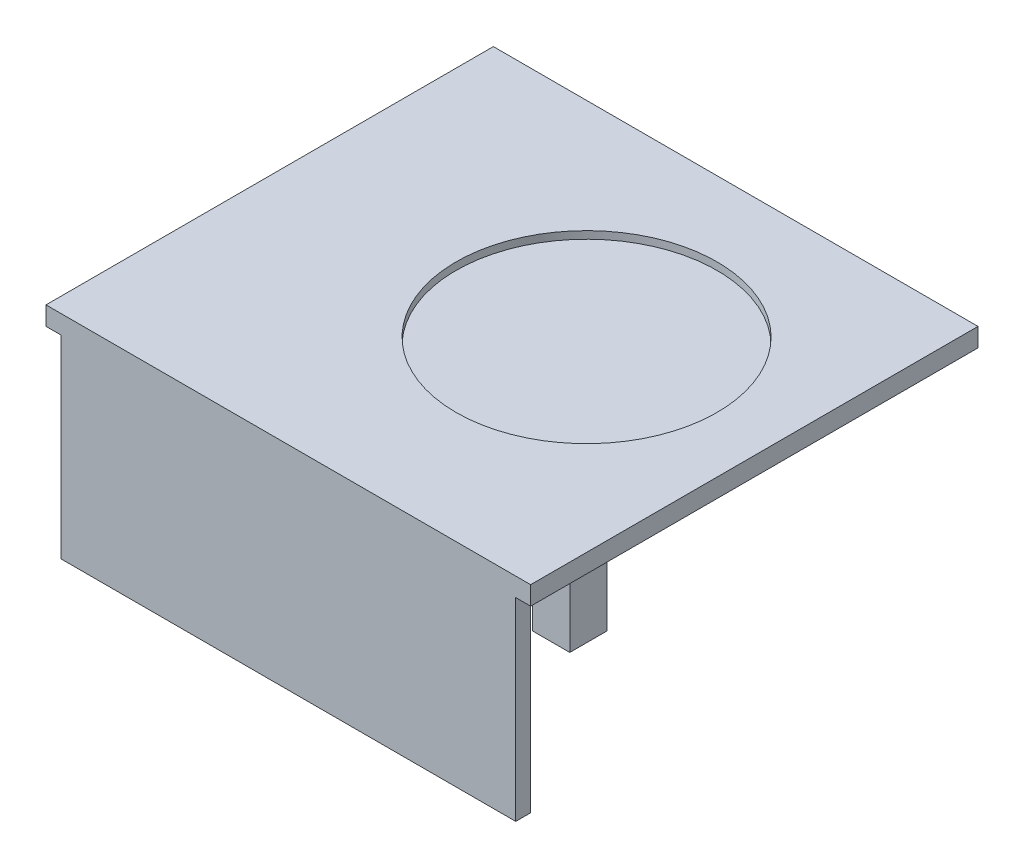
ISO-10303-21;
HEADER;
FILE_DESCRIPTION(('STEP AP214'),'2;1');
FILE_NAME('part.step','',(''),(''),'','','');
FILE_SCHEMA(('AUTOMOTIVE_DESIGN { 1 0 10303 214 1 1 1 1 }'));
ENDSEC;
DATA;
#1=APPLICATION_CONTEXT('core data for automotive mechanical design processes');
#2=APPLICATION_PROTOCOL_DEFINITION('international standard','automotive_design',2000,#1);
#3=PRODUCT_CONTEXT('',#1,'mechanical');
#4=PRODUCT('Part','Part','',(#3));
#5=PRODUCT_RELATED_PRODUCT_CATEGORY('part','',(#4));
#6=PRODUCT_DEFINITION_FORMATION('','',#4);
#7=PRODUCT_DEFINITION_CONTEXT('part definition',#1,'design');
#8=PRODUCT_DEFINITION('design','',#6,#7);
#9=PRODUCT_DEFINITION_SHAPE('','',#8);
#10=(LENGTH_UNIT() NAMED_UNIT(*) SI_UNIT(.MILLI.,.METRE.));
#11=(NAMED_UNIT(*) PLANE_ANGLE_UNIT() SI_UNIT($,.RADIAN.));
#12=(NAMED_UNIT(*) SI_UNIT($,.STERADIAN.) SOLID_ANGLE_UNIT());
#13=UNCERTAINTY_MEASURE_WITH_UNIT(LENGTH_MEASURE(1.E-05),#10,'distance_accuracy_value','');
#14=(GEOMETRIC_REPRESENTATION_CONTEXT(3) GLOBAL_UNCERTAINTY_ASSIGNED_CONTEXT((#13)) GLOBAL_UNIT_ASSIGNED_CONTEXT((#10,
#11,#12)) REPRESENTATION_CONTEXT('',''));
#15=CARTESIAN_POINT('',(0.,0.,0.));
#16=DIRECTION('',(0.,0.,1.));
#17=DIRECTION('',(1.,0.,0.));
#18=AXIS2_PLACEMENT_3D('',#15,#16,#17);
#19=CARTESIAN_POINT('',(0.,0.,0.));
#20=DIRECTION('',(0.,-1.,0.));
#21=DIRECTION('',(0.,0.,-1.));
#22=AXIS2_PLACEMENT_3D('',#19,#20,#21);
#23=PLANE('',#22);
#24=DIRECTION('',(0.,0.,1.));
#25=VECTOR('',#24,1.);
#26=CARTESIAN_POINT('',(61.,0.,56.));
#27=LINE('',#26,#25);
#28=CARTESIAN_POINT('',(61.,0.,56.));
#29=VERTEX_POINT('',#28);
#30=CARTESIAN_POINT('',(61.,0.,60.));
#31=VERTEX_POINT('',#30);
#32=EDGE_CURVE('E178',#29,#31,#27,.T.);
#33=ORIENTED_EDGE('',*,*,#32,.F.);
#34=DIRECTION('',(1.,0.,0.));
#35=VECTOR('',#34,1.);
#36=CARTESIAN_POINT('',(-65.,0.,56.));
#37=LINE('',#36,#35);
#38=CARTESIAN_POINT('',(-61.,0.,56.));
#39=VERTEX_POINT('',#38);
#40=EDGE_CURVE('E171',#39,#29,#37,.T.);
#41=ORIENTED_EDGE('',*,*,#40,.F.);
#42=DIRECTION('',(0.,0.,-1.));
#43=VECTOR('',#42,1.);
#44=CARTESIAN_POINT('',(-61.,0.,61.));
#45=LINE('',#44,#43);
#46=CARTESIAN_POINT('',(-61.,0.,60.));
#47=VERTEX_POINT('',#46);
#48=EDGE_CURVE('E157',#47,#39,#45,.T.);
#49=ORIENTED_EDGE('',*,*,#48,.F.);
#50=DIRECTION('',(1.,0.,0.));
#51=VECTOR('',#50,1.);
#52=CARTESIAN_POINT('',(65.,0.,60.));
#53=LINE('',#52,#51);
#54=CARTESIAN_POINT('',(-65.,0.,60.));
#55=VERTEX_POINT('',#54);
#56=EDGE_CURVE('E242',#55,#47,#53,.T.);
#57=ORIENTED_EDGE('',*,*,#56,.F.);
#58=DIRECTION('',(0.,0.,1.));
#59=VECTOR('',#58,1.);
#60=CARTESIAN_POINT('',(-65.,0.,60.));
#61=LINE('',#60,#59);
#62=CARTESIAN_POINT('',(-65.,0.,-60.));
#63=VERTEX_POINT('',#62);
#64=EDGE_CURVE('E201',#63,#55,#61,.T.);
#65=ORIENTED_EDGE('',*,*,#64,.F.);
#66=DIRECTION('',(-1.,0.,0.));
#67=VECTOR('',#66,1.);
#68=CARTESIAN_POINT('',(-65.,0.,-60.));
#69=LINE('',#68,#67);
#70=CARTESIAN_POINT('',(65.,0.,-60.));
#71=VERTEX_POINT('',#70);
#72=EDGE_CURVE('E207',#71,#63,#69,.T.);
#73=ORIENTED_EDGE('',*,*,#72,.F.);
#74=DIRECTION('',(0.,0.,-1.));
#75=VECTOR('',#74,1.);
#76=CARTESIAN_POINT('',(65.,0.,-60.));
#77=LINE('',#76,#75);
#78=CARTESIAN_POINT('',(65.,0.,60.));
#79=VERTEX_POINT('',#78);
#80=EDGE_CURVE('E222',#79,#71,#77,.T.);
#81=ORIENTED_EDGE('',*,*,#80,.F.);
#82=DIRECTION('',(1.,0.,0.));
#83=VECTOR('',#82,1.);
#84=CARTESIAN_POINT('',(65.,0.,60.));
#85=LINE('',#84,#83);
#86=EDGE_CURVE('E219',#31,#79,#85,.T.);
#87=ORIENTED_EDGE('',*,*,#86,.F.);
#88=EDGE_LOOP('',(#33,#41,#49,#57,#65,#73,#81,#87));
#89=FACE_BOUND('',#88,.T.);
#90=DIRECTION('',(-1.,0.,0.));
#91=VECTOR('',#90,1.);
#92=CARTESIAN_POINT('',(61.,0.,45.5));
#93=LINE('',#92,#91);
#94=CARTESIAN_POINT('',(61.,0.,45.5));
#95=VERTEX_POINT('',#94);
#96=CARTESIAN_POINT('',(51.,0.,45.5));
#97=VERTEX_POINT('',#96);
#98=EDGE_CURVE('E317',#95,#97,#93,.T.);
#99=ORIENTED_EDGE('',*,*,#98,.F.);
#100=DIRECTION('',(0.,0.,1.));
#101=VECTOR('',#100,1.);
#102=CARTESIAN_POINT('',(61.,0.,35.5));
#103=LINE('',#102,#101);
#104=CARTESIAN_POINT('',(61.,0.,35.5));
#105=VERTEX_POINT('',#104);
#106=EDGE_CURVE('E278',#105,#95,#103,.T.);
#107=ORIENTED_EDGE('',*,*,#106,.F.);
#108=DIRECTION('',(1.,0.,0.));
#109=VECTOR('',#108,1.);
#110=CARTESIAN_POINT('',(51.,0.,35.5));
#111=LINE('',#110,#109);
#112=CARTESIAN_POINT('',(51.,0.,35.5));
#113=VERTEX_POINT('',#112);
#114=EDGE_CURVE('E309',#113,#105,#111,.T.);
#115=ORIENTED_EDGE('',*,*,#114,.F.);
#116=DIRECTION('',(0.,0.,-1.));
#117=VECTOR('',#116,1.);
#118=CARTESIAN_POINT('',(51.,0.,45.5));
#119=LINE('',#118,#117);
#120=EDGE_CURVE('E312',#97,#113,#119,.T.);
#121=ORIENTED_EDGE('',*,*,#120,.F.);
#122=EDGE_LOOP('',(#99,#107,#115,#121));
#123=FACE_BOUND('',#122,.T.);
#124=DIRECTION('',(1.,0.,0.));
#125=VECTOR('',#124,1.);
#126=CARTESIAN_POINT('',(-51.,0.,35.5));
#127=LINE('',#126,#125);
#128=CARTESIAN_POINT('',(-61.,0.,35.5));
#129=VERTEX_POINT('',#128);
#130=CARTESIAN_POINT('',(-51.,0.,35.5));
#131=VERTEX_POINT('',#130);
#132=EDGE_CURVE('E277',#129,#131,#127,.T.);
#133=ORIENTED_EDGE('',*,*,#132,.F.);
#134=DIRECTION('',(0.,0.,-1.));
#135=VECTOR('',#134,1.);
#136=CARTESIAN_POINT('',(-61.,0.,35.5));
#137=LINE('',#136,#135);
#138=CARTESIAN_POINT('',(-61.,0.,45.5));
#139=VERTEX_POINT('',#138);
#140=EDGE_CURVE('E273',#139,#129,#137,.T.);
#141=ORIENTED_EDGE('',*,*,#140,.F.);
#142=DIRECTION('',(-1.,0.,0.));
#143=VECTOR('',#142,1.);
#144=CARTESIAN_POINT('',(-61.,0.,45.5));
#145=LINE('',#144,#143);
#146=CARTESIAN_POINT('',(-51.,0.,45.5));
#147=VERTEX_POINT('',#146);
#148=EDGE_CURVE('E263',#147,#139,#145,.T.);
#149=ORIENTED_EDGE('',*,*,#148,.F.);
#150=DIRECTION('',(0.,0.,1.));
#151=VECTOR('',#150,1.);
#152=CARTESIAN_POINT('',(-51.,0.,45.5));
#153=LINE('',#152,#151);
#154=EDGE_CURVE('E281',#131,#147,#153,.T.);
#155=ORIENTED_EDGE('',*,*,#154,.F.);
#156=EDGE_LOOP('',(#133,#141,#149,#155));
#157=FACE_BOUND('',#156,.T.);
#158=ADVANCED_FACE('F45',(#89,#123,#157),#23,.T.);
#159=CARTESIAN_POINT('',(-65.,5.,60.));
#160=DIRECTION('',(1.,0.,0.));
#161=DIRECTION('',(0.,0.,-1.));
#162=AXIS2_PLACEMENT_3D('',#159,#160,#161);
#163=PLANE('',#162);
#164=ORIENTED_EDGE('',*,*,#64,.T.);
#165=DIRECTION('',(0.,-1.,0.));
#166=VECTOR('',#165,1.);
#167=CARTESIAN_POINT('',(-65.,5.,60.));
#168=LINE('',#167,#166);
#169=CARTESIAN_POINT('',(-65.,5.,60.));
#170=VERTEX_POINT('',#169);
#171=EDGE_CURVE('E54',#170,#55,#168,.T.);
#172=ORIENTED_EDGE('',*,*,#171,.F.);
#173=DIRECTION('',(0.,0.,1.));
#174=VECTOR('',#173,1.);
#175=CARTESIAN_POINT('',(-65.,5.,60.));
#176=LINE('',#175,#174);
#177=CARTESIAN_POINT('',(-65.,5.,-60.));
#178=VERTEX_POINT('',#177);
#179=EDGE_CURVE('E202',#178,#170,#176,.T.);
#180=ORIENTED_EDGE('',*,*,#179,.F.);
#181=DIRECTION('',(0.,-1.,0.));
#182=VECTOR('',#181,1.);
#183=CARTESIAN_POINT('',(-65.,5.,-60.));
#184=LINE('',#183,#182);
#185=EDGE_CURVE('E216',#178,#63,#184,.T.);
#186=ORIENTED_EDGE('',*,*,#185,.T.);
#187=EDGE_LOOP('',(#164,#172,#180,#186));
#188=FACE_BOUND('',#187,.T.);
#189=ADVANCED_FACE('F47',(#188),#163,.F.);
#190=CARTESIAN_POINT('',(65.,5.,60.));
#191=DIRECTION('',(0.,0.,-1.));
#192=DIRECTION('',(-1.,0.,0.));
#193=AXIS2_PLACEMENT_3D('',#190,#191,#192);
#194=PLANE('',#193);
#195=ORIENTED_EDGE('',*,*,#56,.T.);
#196=DIRECTION('',(0.,-1.,0.));
#197=VECTOR('',#196,1.);
#198=CARTESIAN_POINT('',(-61.,5.00000000000002,60.));
#199=LINE('',#198,#197);
#200=CARTESIAN_POINT('',(-61.,-52.,60.));
#201=VERTEX_POINT('',#200);
#202=EDGE_CURVE('E160',#47,#201,#199,.T.);
#203=ORIENTED_EDGE('',*,*,#202,.T.);
#204=DIRECTION('',(-1.,0.,0.));
#205=VECTOR('',#204,1.);
#206=CARTESIAN_POINT('',(61.,-52.,60.));
#207=LINE('',#206,#205);
#208=CARTESIAN_POINT('',(61.,-52.,60.));
#209=VERTEX_POINT('',#208);
#210=EDGE_CURVE('E185',#209,#201,#207,.T.);
#211=ORIENTED_EDGE('',*,*,#210,.F.);
#212=DIRECTION('',(0.,1.,0.));
#213=VECTOR('',#212,1.);
#214=CARTESIAN_POINT('',(61.,-52.,60.));
#215=LINE('',#214,#213);
#216=EDGE_CURVE('E194',#209,#31,#215,.T.);
#217=ORIENTED_EDGE('',*,*,#216,.T.);
#218=ORIENTED_EDGE('',*,*,#86,.T.);
#219=DIRECTION('',(0.,-1.,0.));
#220=VECTOR('',#219,1.);
#221=CARTESIAN_POINT('',(65.,5.,60.));
#222=LINE('',#221,#220);
#223=CARTESIAN_POINT('',(65.,5.,60.));
#224=VERTEX_POINT('',#223);
#225=EDGE_CURVE('E234',#224,#79,#222,.T.);
#226=ORIENTED_EDGE('',*,*,#225,.F.);
#227=DIRECTION('',(1.,0.,0.));
#228=VECTOR('',#227,1.);
#229=CARTESIAN_POINT('',(65.,5.,60.));
#230=LINE('',#229,#228);
#231=EDGE_CURVE('E206',#170,#224,#230,.T.);
#232=ORIENTED_EDGE('',*,*,#231,.F.);
#233=ORIENTED_EDGE('',*,*,#171,.T.);
#234=EDGE_LOOP('',(#195,#203,#211,#217,#218,#226,#232,#233));
#235=FACE_BOUND('',#234,.T.);
#236=ADVANCED_FACE('F241',(#235),#194,.F.);
#237=CARTESIAN_POINT('',(65.,5.,-60.));
#238=DIRECTION('',(-1.,0.,0.));
#239=DIRECTION('',(0.,0.,1.));
#240=AXIS2_PLACEMENT_3D('',#237,#238,#239);
#241=PLANE('',#240);
#242=ORIENTED_EDGE('',*,*,#80,.T.);
#243=DIRECTION('',(0.,-1.,0.));
#244=VECTOR('',#243,1.);
#245=CARTESIAN_POINT('',(65.,5.,-60.));
#246=LINE('',#245,#244);
#247=CARTESIAN_POINT('',(65.,5.,-60.));
#248=VERTEX_POINT('',#247);
#249=EDGE_CURVE('E230',#248,#71,#246,.T.);
#250=ORIENTED_EDGE('',*,*,#249,.F.);
#251=DIRECTION('',(0.,0.,-1.));
#252=VECTOR('',#251,1.);
#253=CARTESIAN_POINT('',(65.,5.,-60.));
#254=LINE('',#253,#252);
#255=EDGE_CURVE('E210',#224,#248,#254,.T.);
#256=ORIENTED_EDGE('',*,*,#255,.F.);
#257=ORIENTED_EDGE('',*,*,#225,.T.);
#258=EDGE_LOOP('',(#242,#250,#256,#257));
#259=FACE_BOUND('',#258,.T.);
#260=ADVANCED_FACE('F351',(#259),#241,.F.);
#261=CARTESIAN_POINT('',(-65.,5.,-60.));
#262=DIRECTION('',(0.,0.,1.));
#263=DIRECTION('',(1.,0.,0.));
#264=AXIS2_PLACEMENT_3D('',#261,#262,#263);
#265=PLANE('',#264);
#266=ORIENTED_EDGE('',*,*,#72,.T.);
#267=ORIENTED_EDGE('',*,*,#185,.F.);
#268=DIRECTION('',(-1.,0.,0.));
#269=VECTOR('',#268,1.);
#270=CARTESIAN_POINT('',(-65.,5.,-60.));
#271=LINE('',#270,#269);
#272=EDGE_CURVE('E213',#248,#178,#271,.T.);
#273=ORIENTED_EDGE('',*,*,#272,.F.);
#274=ORIENTED_EDGE('',*,*,#249,.T.);
#275=EDGE_LOOP('',(#266,#267,#273,#274));
#276=FACE_BOUND('',#275,.T.);
#277=ADVANCED_FACE('F354',(#276),#265,.F.);
#278=CARTESIAN_POINT('',(0.,5.,0.));
#279=DIRECTION('',(0.,-1.,0.));
#280=DIRECTION('',(0.,0.,-1.));
#281=AXIS2_PLACEMENT_3D('',#278,#279,#280);
#282=PLANE('',#281);
#283=CARTESIAN_POINT('',(15.,5.,-5.));
#284=DIRECTION('',(0.,1.,0.));
#285=DIRECTION('',(0.,0.,1.));
#286=AXIS2_PLACEMENT_3D('',#283,#284,#285);
#287=CIRCLE('',#286,35.);
#288=CARTESIAN_POINT('',(15.,5.,30.));
#289=VERTEX_POINT('',#288);
#290=EDGE_CURVE('E188',#289,#289,#287,.T.);
#291=ORIENTED_EDGE('',*,*,#290,.F.);
#292=EDGE_LOOP('',(#291));
#293=FACE_BOUND('',#292,.T.);
#294=ORIENTED_EDGE('',*,*,#179,.T.);
#295=ORIENTED_EDGE('',*,*,#231,.T.);
#296=ORIENTED_EDGE('',*,*,#255,.T.);
#297=ORIENTED_EDGE('',*,*,#272,.T.);
#298=EDGE_LOOP('',(#294,#295,#296,#297));
#299=FACE_BOUND('',#298,.T.);
#300=ADVANCED_FACE('F357',(#293,#299),#282,.F.);
#301=CARTESIAN_POINT('',(-65.,-52.,56.));
#302=DIRECTION('',(0.,0.,1.));
#303=DIRECTION('',(1.,0.,0.));
#304=AXIS2_PLACEMENT_3D('',#301,#302,#303);
#305=PLANE('',#304);
#306=DIRECTION('',(1.,0.,0.));
#307=VECTOR('',#306,1.);
#308=CARTESIAN_POINT('',(-65.,-52.,56.));
#309=LINE('',#308,#307);
#310=CARTESIAN_POINT('',(-61.,-52.,56.));
#311=VERTEX_POINT('',#310);
#312=CARTESIAN_POINT('',(61.,-52.,56.));
#313=VERTEX_POINT('',#312);
#314=EDGE_CURVE('E173',#311,#313,#309,.T.);
#315=ORIENTED_EDGE('',*,*,#314,.F.);
#316=DIRECTION('',(0.,-1.,0.));
#317=VECTOR('',#316,1.);
#318=CARTESIAN_POINT('',(-61.,0.,56.));
#319=LINE('',#318,#317);
#320=EDGE_CURVE('E60',#39,#311,#319,.T.);
#321=ORIENTED_EDGE('',*,*,#320,.F.);
#322=ORIENTED_EDGE('',*,*,#40,.T.);
#323=DIRECTION('',(0.,1.,0.));
#324=VECTOR('',#323,1.);
#325=CARTESIAN_POINT('',(61.,-52.,56.));
#326=LINE('',#325,#324);
#327=EDGE_CURVE('E198',#313,#29,#326,.T.);
#328=ORIENTED_EDGE('',*,*,#327,.F.);
#329=EDGE_LOOP('',(#315,#321,#322,#328));
#330=FACE_BOUND('',#329,.T.);
#331=ADVANCED_FACE('F169',(#330),#305,.F.);
#332=CARTESIAN_POINT('',(61.,-52.,56.));
#333=DIRECTION('',(-1.,0.,0.));
#334=DIRECTION('',(0.,0.,1.));
#335=AXIS2_PLACEMENT_3D('',#332,#333,#334);
#336=PLANE('',#335);
#337=ORIENTED_EDGE('',*,*,#32,.T.);
#338=ORIENTED_EDGE('',*,*,#216,.F.);
#339=DIRECTION('',(0.,0.,1.));
#340=VECTOR('',#339,1.);
#341=CARTESIAN_POINT('',(61.,-52.,56.));
#342=LINE('',#341,#340);
#343=EDGE_CURVE('E191',#313,#209,#342,.T.);
#344=ORIENTED_EDGE('',*,*,#343,.F.);
#345=ORIENTED_EDGE('',*,*,#327,.T.);
#346=EDGE_LOOP('',(#337,#338,#344,#345));
#347=FACE_BOUND('',#346,.T.);
#348=ADVANCED_FACE('F347',(#347),#336,.F.);
#349=CARTESIAN_POINT('',(0.,-52.,0.));
#350=DIRECTION('',(0.,-1.,0.));
#351=DIRECTION('',(0.,0.,-1.));
#352=AXIS2_PLACEMENT_3D('',#349,#350,#351);
#353=PLANE('',#352);
#354=DIRECTION('',(0.,0.,1.));
#355=VECTOR('',#354,1.);
#356=CARTESIAN_POINT('',(-61.,-52.,0.));
#357=LINE('',#356,#355);
#358=EDGE_CURVE('E11',#311,#201,#357,.T.);
#359=ORIENTED_EDGE('',*,*,#358,.F.);
#360=ORIENTED_EDGE('',*,*,#314,.T.);
#361=ORIENTED_EDGE('',*,*,#343,.T.);
#362=ORIENTED_EDGE('',*,*,#210,.T.);
#363=EDGE_LOOP('',(#359,#360,#361,#362));
#364=FACE_BOUND('',#363,.T.);
#365=ADVANCED_FACE('F344',(#364),#353,.T.);
#366=CARTESIAN_POINT('',(15.,3.,-5.));
#367=DIRECTION('',(0.,1.,0.));
#368=DIRECTION('',(0.,0.,1.));
#369=AXIS2_PLACEMENT_3D('',#366,#367,#368);
#370=CYLINDRICAL_SURFACE('',#369,35.);
#371=CARTESIAN_POINT('',(15.,3.,-5.));
#372=DIRECTION('',(0.,1.,0.));
#373=DIRECTION('',(0.,0.,1.));
#374=AXIS2_PLACEMENT_3D('',#371,#372,#373);
#375=CIRCLE('',#374,35.);
#376=CARTESIAN_POINT('',(15.,3.,30.));
#377=VERTEX_POINT('',#376);
#378=EDGE_CURVE('E181',#377,#377,#375,.T.);
#379=ORIENTED_EDGE('',*,*,#378,.F.);
#380=EDGE_LOOP('',(#379));
#381=FACE_BOUND('',#380,.T.);
#382=ORIENTED_EDGE('',*,*,#290,.T.);
#383=EDGE_LOOP('',(#382));
#384=FACE_BOUND('',#383,.T.);
#385=ADVANCED_FACE('F396',(#381,#384),#370,.F.);
#386=CARTESIAN_POINT('',(15.,3.,-5.));
#387=DIRECTION('',(0.,1.,0.));
#388=DIRECTION('',(0.,0.,1.));
#389=AXIS2_PLACEMENT_3D('',#386,#387,#388);
#390=PLANE('',#389);
#391=ORIENTED_EDGE('',*,*,#378,.T.);
#392=EDGE_LOOP('',(#391));
#393=FACE_BOUND('',#392,.T.);
#394=ADVANCED_FACE('F510',(#393),#390,.T.);
#395=CARTESIAN_POINT('',(61.,-20.,35.5));
#396=DIRECTION('',(-1.,0.,0.));
#397=DIRECTION('',(0.,0.,1.));
#398=AXIS2_PLACEMENT_3D('',#395,#396,#397);
#399=PLANE('',#398);
#400=ORIENTED_EDGE('',*,*,#106,.T.);
#401=DIRECTION('',(0.,1.,0.));
#402=VECTOR('',#401,1.);
#403=CARTESIAN_POINT('',(61.,-20.,45.5));
#404=LINE('',#403,#402);
#405=CARTESIAN_POINT('',(61.,-20.,45.5));
#406=VERTEX_POINT('',#405);
#407=EDGE_CURVE('E250',#406,#95,#404,.T.);
#408=ORIENTED_EDGE('',*,*,#407,.F.);
#409=DIRECTION('',(0.,0.,1.));
#410=VECTOR('',#409,1.);
#411=CARTESIAN_POINT('',(61.,-20.,35.5));
#412=LINE('',#411,#410);
#413=CARTESIAN_POINT('',(61.,-20.,35.5));
#414=VERTEX_POINT('',#413);
#415=EDGE_CURVE('E313',#414,#406,#412,.T.);
#416=ORIENTED_EDGE('',*,*,#415,.F.);
#417=DIRECTION('',(0.,1.,0.));
#418=VECTOR('',#417,1.);
#419=CARTESIAN_POINT('',(61.,-20.,35.5));
#420=LINE('',#419,#418);
#421=EDGE_CURVE('E304',#414,#105,#420,.T.);
#422=ORIENTED_EDGE('',*,*,#421,.T.);
#423=EDGE_LOOP('',(#400,#408,#416,#422));
#424=FACE_BOUND('',#423,.T.);
#425=ADVANCED_FACE('F501',(#424),#399,.F.);
#426=CARTESIAN_POINT('',(61.,-20.,45.5));
#427=DIRECTION('',(0.,0.,-1.));
#428=DIRECTION('',(-1.,0.,0.));
#429=AXIS2_PLACEMENT_3D('',#426,#427,#428);
#430=PLANE('',#429);
#431=ORIENTED_EDGE('',*,*,#98,.T.);
#432=DIRECTION('',(0.,1.,0.));
#433=VECTOR('',#432,1.);
#434=CARTESIAN_POINT('',(51.,-20.,45.5));
#435=LINE('',#434,#433);
#436=CARTESIAN_POINT('',(51.,-20.,45.5));
#437=VERTEX_POINT('',#436);
#438=EDGE_CURVE('E254',#437,#97,#435,.T.);
#439=ORIENTED_EDGE('',*,*,#438,.F.);
#440=DIRECTION('',(-1.,0.,0.));
#441=VECTOR('',#440,1.);
#442=CARTESIAN_POINT('',(61.,-20.,45.5));
#443=LINE('',#442,#441);
#444=EDGE_CURVE('E328',#406,#437,#443,.T.);
#445=ORIENTED_EDGE('',*,*,#444,.F.);
#446=ORIENTED_EDGE('',*,*,#407,.T.);
#447=EDGE_LOOP('',(#431,#439,#445,#446));
#448=FACE_BOUND('',#447,.T.);
#449=ADVANCED_FACE('F492',(#448),#430,.F.);
#450=CARTESIAN_POINT('',(51.,-20.,45.5));
#451=DIRECTION('',(1.,0.,0.));
#452=DIRECTION('',(0.,0.,-1.));
#453=AXIS2_PLACEMENT_3D('',#450,#451,#452);
#454=PLANE('',#453);
#455=ORIENTED_EDGE('',*,*,#120,.T.);
#456=DIRECTION('',(0.,1.,0.));
#457=VECTOR('',#456,1.);
#458=CARTESIAN_POINT('',(51.,-20.,35.5));
#459=LINE('',#458,#457);
#460=CARTESIAN_POINT('',(51.,-20.,35.5));
#461=VERTEX_POINT('',#460);
#462=EDGE_CURVE('E301',#461,#113,#459,.T.);
#463=ORIENTED_EDGE('',*,*,#462,.F.);
#464=DIRECTION('',(0.,0.,-1.));
#465=VECTOR('',#464,1.);
#466=CARTESIAN_POINT('',(51.,-20.,45.5));
#467=LINE('',#466,#465);
#468=EDGE_CURVE('E325',#437,#461,#467,.T.);
#469=ORIENTED_EDGE('',*,*,#468,.F.);
#470=ORIENTED_EDGE('',*,*,#438,.T.);
#471=EDGE_LOOP('',(#455,#463,#469,#470));
#472=FACE_BOUND('',#471,.T.);
#473=ADVANCED_FACE('F482',(#472),#454,.F.);
#474=CARTESIAN_POINT('',(51.,-20.,35.5));
#475=DIRECTION('',(0.,0.,1.));
#476=DIRECTION('',(1.,0.,0.));
#477=AXIS2_PLACEMENT_3D('',#474,#475,#476);
#478=PLANE('',#477);
#479=ORIENTED_EDGE('',*,*,#114,.T.);
#480=ORIENTED_EDGE('',*,*,#421,.F.);
#481=DIRECTION('',(1.,0.,0.));
#482=VECTOR('',#481,1.);
#483=CARTESIAN_POINT('',(51.,-20.,35.5));
#484=LINE('',#483,#482);
#485=EDGE_CURVE('E308',#461,#414,#484,.T.);
#486=ORIENTED_EDGE('',*,*,#485,.F.);
#487=ORIENTED_EDGE('',*,*,#462,.T.);
#488=EDGE_LOOP('',(#479,#480,#486,#487));
#489=FACE_BOUND('',#488,.T.);
#490=ADVANCED_FACE('F472',(#489),#478,.F.);
#491=CARTESIAN_POINT('',(0.,-20.,0.));
#492=DIRECTION('',(0.,-1.,0.));
#493=DIRECTION('',(0.,0.,-1.));
#494=AXIS2_PLACEMENT_3D('',#491,#492,#493);
#495=PLANE('',#494);
#496=ORIENTED_EDGE('',*,*,#415,.T.);
#497=ORIENTED_EDGE('',*,*,#444,.T.);
#498=ORIENTED_EDGE('',*,*,#468,.T.);
#499=ORIENTED_EDGE('',*,*,#485,.T.);
#500=EDGE_LOOP('',(#496,#497,#498,#499));
#501=FACE_BOUND('',#500,.T.);
#502=ADVANCED_FACE('F462',(#501),#495,.T.);
#503=CARTESIAN_POINT('',(-61.,-20.,35.5));
#504=DIRECTION('',(1.,0.,0.));
#505=DIRECTION('',(0.,0.,-1.));
#506=AXIS2_PLACEMENT_3D('',#503,#504,#505);
#507=PLANE('',#506);
#508=ORIENTED_EDGE('',*,*,#140,.T.);
#509=DIRECTION('',(0.,1.,0.));
#510=VECTOR('',#509,1.);
#511=CARTESIAN_POINT('',(-61.,-20.,35.5));
#512=LINE('',#511,#510);
#513=CARTESIAN_POINT('',(-61.,-20.,35.5));
#514=VERTEX_POINT('',#513);
#515=EDGE_CURVE('E295',#514,#129,#512,.T.);
#516=ORIENTED_EDGE('',*,*,#515,.F.);
#517=DIRECTION('',(0.,0.,-1.));
#518=VECTOR('',#517,1.);
#519=CARTESIAN_POINT('',(-61.,-20.,35.5));
#520=LINE('',#519,#518);
#521=CARTESIAN_POINT('',(-61.,-20.,45.5));
#522=VERTEX_POINT('',#521);
#523=EDGE_CURVE('E258',#522,#514,#520,.T.);
#524=ORIENTED_EDGE('',*,*,#523,.F.);
#525=DIRECTION('',(0.,1.,0.));
#526=VECTOR('',#525,1.);
#527=CARTESIAN_POINT('',(-61.,-20.,45.5));
#528=LINE('',#527,#526);
#529=EDGE_CURVE('E272',#522,#139,#528,.T.);
#530=ORIENTED_EDGE('',*,*,#529,.T.);
#531=EDGE_LOOP('',(#508,#516,#524,#530));
#532=FACE_BOUND('',#531,.T.);
#533=ADVANCED_FACE('F452',(#532),#507,.F.);
#534=CARTESIAN_POINT('',(-51.,-20.,35.5));
#535=DIRECTION('',(0.,0.,1.));
#536=DIRECTION('',(1.,0.,0.));
#537=AXIS2_PLACEMENT_3D('',#534,#535,#536);
#538=PLANE('',#537);
#539=ORIENTED_EDGE('',*,*,#132,.T.);
#540=DIRECTION('',(0.,1.,0.));
#541=VECTOR('',#540,1.);
#542=CARTESIAN_POINT('',(-51.,-20.,35.5));
#543=LINE('',#542,#541);
#544=CARTESIAN_POINT('',(-51.,-20.,35.5));
#545=VERTEX_POINT('',#544);
#546=EDGE_CURVE('E291',#545,#131,#543,.T.);
#547=ORIENTED_EDGE('',*,*,#546,.F.);
#548=DIRECTION('',(1.,0.,0.));
#549=VECTOR('',#548,1.);
#550=CARTESIAN_POINT('',(-51.,-20.,35.5));
#551=LINE('',#550,#549);
#552=EDGE_CURVE('E262',#514,#545,#551,.T.);
#553=ORIENTED_EDGE('',*,*,#552,.F.);
#554=ORIENTED_EDGE('',*,*,#515,.T.);
#555=EDGE_LOOP('',(#539,#547,#553,#554));
#556=FACE_BOUND('',#555,.T.);
#557=ADVANCED_FACE('F442',(#556),#538,.F.);
#558=CARTESIAN_POINT('',(-51.,-20.,45.5));
#559=DIRECTION('',(-1.,0.,0.));
#560=DIRECTION('',(0.,0.,1.));
#561=AXIS2_PLACEMENT_3D('',#558,#559,#560);
#562=PLANE('',#561);
#563=ORIENTED_EDGE('',*,*,#154,.T.);
#564=DIRECTION('',(0.,1.,0.));
#565=VECTOR('',#564,1.);
#566=CARTESIAN_POINT('',(-51.,-20.,45.5));
#567=LINE('',#566,#565);
#568=CARTESIAN_POINT('',(-51.,-20.,45.5));
#569=VERTEX_POINT('',#568);
#570=EDGE_CURVE('E68',#569,#147,#567,.T.);
#571=ORIENTED_EDGE('',*,*,#570,.F.);
#572=DIRECTION('',(0.,0.,1.));
#573=VECTOR('',#572,1.);
#574=CARTESIAN_POINT('',(-51.,-20.,45.5));
#575=LINE('',#574,#573);
#576=EDGE_CURVE('E266',#545,#569,#575,.T.);
#577=ORIENTED_EDGE('',*,*,#576,.F.);
#578=ORIENTED_EDGE('',*,*,#546,.T.);
#579=EDGE_LOOP('',(#563,#571,#577,#578));
#580=FACE_BOUND('',#579,.T.);
#581=ADVANCED_FACE('F433',(#580),#562,.F.);
#582=CARTESIAN_POINT('',(-61.,-20.,45.5));
#583=DIRECTION('',(0.,0.,-1.));
#584=DIRECTION('',(-1.,0.,0.));
#585=AXIS2_PLACEMENT_3D('',#582,#583,#584);
#586=PLANE('',#585);
#587=ORIENTED_EDGE('',*,*,#148,.T.);
#588=ORIENTED_EDGE('',*,*,#529,.F.);
#589=DIRECTION('',(-1.,0.,0.));
#590=VECTOR('',#589,1.);
#591=CARTESIAN_POINT('',(-61.,-20.,45.5));
#592=LINE('',#591,#590);
#593=EDGE_CURVE('E269',#569,#522,#592,.T.);
#594=ORIENTED_EDGE('',*,*,#593,.F.);
#595=ORIENTED_EDGE('',*,*,#570,.T.);
#596=EDGE_LOOP('',(#587,#588,#594,#595));
#597=FACE_BOUND('',#596,.T.);
#598=ADVANCED_FACE('F423',(#597),#586,.F.);
#599=CARTESIAN_POINT('',(0.,-20.,0.));
#600=DIRECTION('',(0.,1.,0.));
#601=DIRECTION('',(0.,0.,1.));
#602=AXIS2_PLACEMENT_3D('',#599,#600,#601);
#603=PLANE('',#602);
#604=ORIENTED_EDGE('',*,*,#523,.T.);
#605=ORIENTED_EDGE('',*,*,#552,.T.);
#606=ORIENTED_EDGE('',*,*,#576,.T.);
#607=ORIENTED_EDGE('',*,*,#593,.T.);
#608=EDGE_LOOP('',(#604,#605,#606,#607));
#609=FACE_BOUND('',#608,.T.);
#610=ADVANCED_FACE('F404',(#609),#603,.F.);
#611=CARTESIAN_POINT('',(-61.,0.,61.));
#612=DIRECTION('',(1.,0.,0.));
#613=DIRECTION('',(0.,1.,0.));
#614=AXIS2_PLACEMENT_3D('',#611,#612,#613);
#615=PLANE('',#614);
#616=ORIENTED_EDGE('',*,*,#48,.T.);
#617=ORIENTED_EDGE('',*,*,#320,.T.);
#618=ORIENTED_EDGE('',*,*,#358,.T.);
#619=ORIENTED_EDGE('',*,*,#202,.F.);
#620=EDGE_LOOP('',(#616,#617,#618,#619));
#621=FACE_BOUND('',#620,.T.);
#622=ADVANCED_FACE('F158',(#621),#615,.F.);
#623=CLOSED_SHELL('',(#158,#189,#236,#260,#277,#300,#331,#348,#365,#385,#394,#425,#449,#473,
#490,#502,#533,#557,#581,#598,#610,#622));
#624=MANIFOLD_SOLID_BREP('B2',#623);
#625=ADVANCED_BREP_SHAPE_REPRESENTATION('',(#18,#624),#14);
#626=SHAPE_DEFINITION_REPRESENTATION(#9,#625);
ENDSEC;
END-ISO-10303-21;
